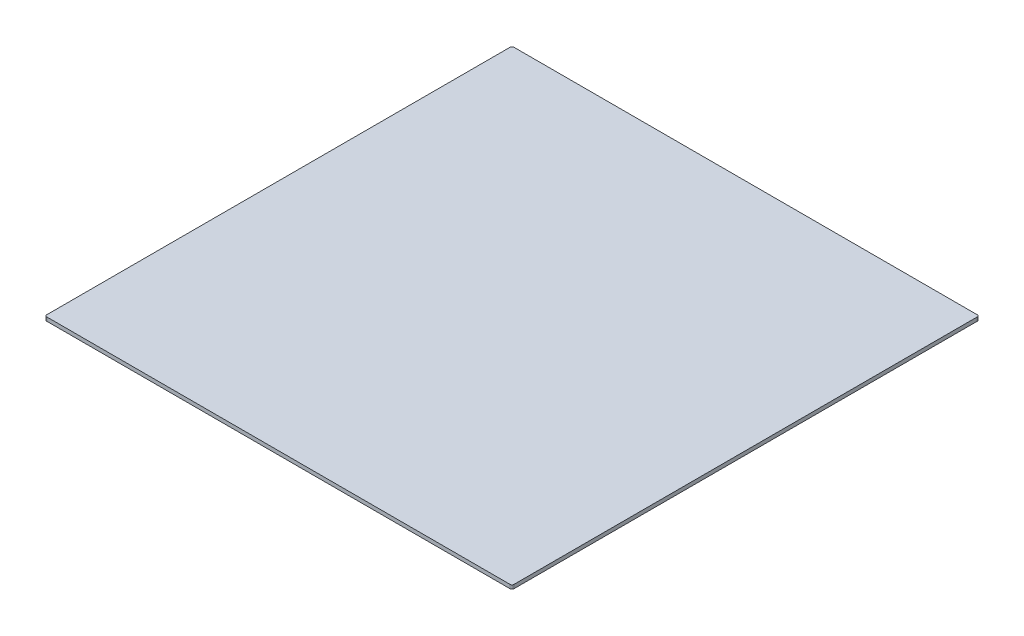
ISO-10303-21;
HEADER;
FILE_DESCRIPTION(('STEP AP214'),'2;1');
FILE_NAME('part.step','',(''),(''),'','','');
FILE_SCHEMA(('AUTOMOTIVE_DESIGN { 1 0 10303 214 1 1 1 1 }'));
ENDSEC;
DATA;
#1=APPLICATION_CONTEXT('core data for automotive mechanical design processes');
#2=APPLICATION_PROTOCOL_DEFINITION('international standard','automotive_design',2000,#1);
#3=PRODUCT_CONTEXT('',#1,'mechanical');
#4=PRODUCT('Part','Part','',(#3));
#5=PRODUCT_RELATED_PRODUCT_CATEGORY('part','',(#4));
#6=PRODUCT_DEFINITION_FORMATION('','',#4);
#7=PRODUCT_DEFINITION_CONTEXT('part definition',#1,'design');
#8=PRODUCT_DEFINITION('design','',#6,#7);
#9=PRODUCT_DEFINITION_SHAPE('','',#8);
#10=(LENGTH_UNIT() NAMED_UNIT(*) SI_UNIT(.MILLI.,.METRE.));
#11=(NAMED_UNIT(*) PLANE_ANGLE_UNIT() SI_UNIT($,.RADIAN.));
#12=(NAMED_UNIT(*) SI_UNIT($,.STERADIAN.) SOLID_ANGLE_UNIT());
#13=UNCERTAINTY_MEASURE_WITH_UNIT(LENGTH_MEASURE(1.E-05),#10,'distance_accuracy_value','');
#14=(GEOMETRIC_REPRESENTATION_CONTEXT(3) GLOBAL_UNCERTAINTY_ASSIGNED_CONTEXT((#13)) GLOBAL_UNIT_ASSIGNED_CONTEXT((#10,
#11,#12)) REPRESENTATION_CONTEXT('',''));
#15=CARTESIAN_POINT('',(0.,0.,0.));
#16=DIRECTION('',(0.,0.,1.));
#17=DIRECTION('',(1.,0.,0.));
#18=AXIS2_PLACEMENT_3D('',#15,#16,#17);
#19=CARTESIAN_POINT('',(123.5,1.,123.5));
#20=DIRECTION('',(-1.,0.,0.));
#21=DIRECTION('',(0.,0.,1.));
#22=AXIS2_PLACEMENT_3D('',#19,#20,#21);
#23=PLANE('',#22);
#24=DIRECTION('',(0.,0.,-1.));
#25=VECTOR('',#24,1.);
#26=CARTESIAN_POINT('',(123.5,-1.,123.5));
#27=LINE('',#26,#25);
#28=CARTESIAN_POINT('',(123.5,-1.,122.5));
#29=VERTEX_POINT('',#28);
#30=CARTESIAN_POINT('',(123.5,-1.,-122.5));
#31=VERTEX_POINT('',#30);
#32=EDGE_CURVE('E182',#29,#31,#27,.T.);
#33=ORIENTED_EDGE('',*,*,#32,.T.);
#34=DIRECTION('',(0.,-1.,0.));
#35=VECTOR('',#34,1.);
#36=CARTESIAN_POINT('',(123.5,1.,-122.5));
#37=LINE('',#36,#35);
#38=CARTESIAN_POINT('',(123.5,1.,-122.5));
#39=VERTEX_POINT('',#38);
#40=EDGE_CURVE('E11',#31,#39,#37,.F.);
#41=ORIENTED_EDGE('',*,*,#40,.T.);
#42=DIRECTION('',(0.,0.,-1.));
#43=VECTOR('',#42,1.);
#44=CARTESIAN_POINT('',(123.5,1.,123.5));
#45=LINE('',#44,#43);
#46=CARTESIAN_POINT('',(123.5,1.,122.5));
#47=VERTEX_POINT('',#46);
#48=EDGE_CURVE('E135',#47,#39,#45,.T.);
#49=ORIENTED_EDGE('',*,*,#48,.F.);
#50=DIRECTION('',(0.,-1.,0.));
#51=VECTOR('',#50,1.);
#52=CARTESIAN_POINT('',(123.5,1.,122.5));
#53=LINE('',#52,#51);
#54=EDGE_CURVE('E48',#47,#29,#53,.T.);
#55=ORIENTED_EDGE('',*,*,#54,.T.);
#56=EDGE_LOOP('',(#33,#41,#49,#55));
#57=FACE_BOUND('',#56,.T.);
#58=ADVANCED_FACE('F39',(#57),#23,.F.);
#59=CARTESIAN_POINT('',(-123.5,1.,-123.5));
#60=DIRECTION('',(0.,0.,1.));
#61=DIRECTION('',(1.,0.,0.));
#62=AXIS2_PLACEMENT_3D('',#59,#60,#61);
#63=PLANE('',#62);
#64=DIRECTION('',(-1.,0.,0.));
#65=VECTOR('',#64,1.);
#66=CARTESIAN_POINT('',(-123.5,-1.,-123.5));
#67=LINE('',#66,#65);
#68=CARTESIAN_POINT('',(122.5,-1.,-123.5));
#69=VERTEX_POINT('',#68);
#70=CARTESIAN_POINT('',(-122.5,-1.,-123.5));
#71=VERTEX_POINT('',#70);
#72=EDGE_CURVE('E142',#69,#71,#67,.T.);
#73=ORIENTED_EDGE('',*,*,#72,.T.);
#74=DIRECTION('',(0.,-1.,0.));
#75=VECTOR('',#74,1.);
#76=CARTESIAN_POINT('',(-122.5,1.,-123.5));
#77=LINE('',#76,#75);
#78=CARTESIAN_POINT('',(-122.5,1.,-123.5));
#79=VERTEX_POINT('',#78);
#80=EDGE_CURVE('E55',#71,#79,#77,.F.);
#81=ORIENTED_EDGE('',*,*,#80,.T.);
#82=DIRECTION('',(-1.,0.,0.));
#83=VECTOR('',#82,1.);
#84=CARTESIAN_POINT('',(-123.5,1.,-123.5));
#85=LINE('',#84,#83);
#86=CARTESIAN_POINT('',(122.5,1.,-123.5));
#87=VERTEX_POINT('',#86);
#88=EDGE_CURVE('E140',#87,#79,#85,.T.);
#89=ORIENTED_EDGE('',*,*,#88,.F.);
#90=DIRECTION('',(0.,-1.,0.));
#91=VECTOR('',#90,1.);
#92=CARTESIAN_POINT('',(122.5,1.,-123.5));
#93=LINE('',#92,#91);
#94=EDGE_CURVE('E171',#87,#69,#93,.T.);
#95=ORIENTED_EDGE('',*,*,#94,.T.);
#96=EDGE_LOOP('',(#73,#81,#89,#95));
#97=FACE_BOUND('',#96,.T.);
#98=ADVANCED_FACE('F207',(#97),#63,.F.);
#99=CARTESIAN_POINT('',(-123.5,1.,123.5));
#100=DIRECTION('',(1.,0.,0.));
#101=DIRECTION('',(0.,0.,-1.));
#102=AXIS2_PLACEMENT_3D('',#99,#100,#101);
#103=PLANE('',#102);
#104=DIRECTION('',(0.,0.,1.));
#105=VECTOR('',#104,1.);
#106=CARTESIAN_POINT('',(-123.5,-1.,123.5));
#107=LINE('',#106,#105);
#108=CARTESIAN_POINT('',(-123.5,-1.,-122.5));
#109=VERTEX_POINT('',#108);
#110=CARTESIAN_POINT('',(-123.5,-1.,122.5));
#111=VERTEX_POINT('',#110);
#112=EDGE_CURVE('E136',#109,#111,#107,.T.);
#113=ORIENTED_EDGE('',*,*,#112,.T.);
#114=DIRECTION('',(0.,-1.,0.));
#115=VECTOR('',#114,1.);
#116=CARTESIAN_POINT('',(-123.5,1.,122.5));
#117=LINE('',#116,#115);
#118=CARTESIAN_POINT('',(-123.5,1.,122.5));
#119=VERTEX_POINT('',#118);
#120=EDGE_CURVE('E111',#111,#119,#117,.F.);
#121=ORIENTED_EDGE('',*,*,#120,.T.);
#122=DIRECTION('',(0.,0.,1.));
#123=VECTOR('',#122,1.);
#124=CARTESIAN_POINT('',(-123.5,1.,123.5));
#125=LINE('',#124,#123);
#126=CARTESIAN_POINT('',(-123.5,1.,-122.5));
#127=VERTEX_POINT('',#126);
#128=EDGE_CURVE('E193',#127,#119,#125,.T.);
#129=ORIENTED_EDGE('',*,*,#128,.F.);
#130=DIRECTION('',(0.,-1.,0.));
#131=VECTOR('',#130,1.);
#132=CARTESIAN_POINT('',(-123.5,1.,-122.5));
#133=LINE('',#132,#131);
#134=EDGE_CURVE('E117',#127,#109,#133,.T.);
#135=ORIENTED_EDGE('',*,*,#134,.T.);
#136=EDGE_LOOP('',(#113,#121,#129,#135));
#137=FACE_BOUND('',#136,.T.);
#138=ADVANCED_FACE('F206',(#137),#103,.F.);
#139=CARTESIAN_POINT('',(-123.5,1.,123.5));
#140=DIRECTION('',(0.,0.,-1.));
#141=DIRECTION('',(-1.,0.,0.));
#142=AXIS2_PLACEMENT_3D('',#139,#140,#141);
#143=PLANE('',#142);
#144=DIRECTION('',(1.,0.,0.));
#145=VECTOR('',#144,1.);
#146=CARTESIAN_POINT('',(-123.5,1.,123.5));
#147=LINE('',#146,#145);
#148=CARTESIAN_POINT('',(-122.5,1.,123.5));
#149=VERTEX_POINT('',#148);
#150=CARTESIAN_POINT('',(122.5,1.,123.5));
#151=VERTEX_POINT('',#150);
#152=EDGE_CURVE('E127',#149,#151,#147,.T.);
#153=ORIENTED_EDGE('',*,*,#152,.F.);
#154=DIRECTION('',(0.,-1.,0.));
#155=VECTOR('',#154,1.);
#156=CARTESIAN_POINT('',(-122.5,1.,123.5));
#157=LINE('',#156,#155);
#158=CARTESIAN_POINT('',(-122.5,-1.,123.5));
#159=VERTEX_POINT('',#158);
#160=EDGE_CURVE('E110',#149,#159,#157,.T.);
#161=ORIENTED_EDGE('',*,*,#160,.T.);
#162=DIRECTION('',(1.,0.,0.));
#163=VECTOR('',#162,1.);
#164=CARTESIAN_POINT('',(-123.5,-1.,123.5));
#165=LINE('',#164,#163);
#166=CARTESIAN_POINT('',(122.5,-1.,123.5));
#167=VERTEX_POINT('',#166);
#168=EDGE_CURVE('E124',#159,#167,#165,.T.);
#169=ORIENTED_EDGE('',*,*,#168,.T.);
#170=DIRECTION('',(0.,-1.,0.));
#171=VECTOR('',#170,1.);
#172=CARTESIAN_POINT('',(122.5,1.,123.5));
#173=LINE('',#172,#171);
#174=EDGE_CURVE('E130',#167,#151,#173,.F.);
#175=ORIENTED_EDGE('',*,*,#174,.T.);
#176=EDGE_LOOP('',(#153,#161,#169,#175));
#177=FACE_BOUND('',#176,.T.);
#178=ADVANCED_FACE('F123',(#177),#143,.F.);
#179=CARTESIAN_POINT('',(0.,1.,0.));
#180=DIRECTION('',(0.,-1.,0.));
#181=DIRECTION('',(0.,0.,-1.));
#182=AXIS2_PLACEMENT_3D('',#179,#180,#181);
#183=PLANE('',#182);
#184=ORIENTED_EDGE('',*,*,#128,.T.);
#185=CARTESIAN_POINT('',(-122.5,1.,122.5));
#186=DIRECTION('',(0.,-1.,0.));
#187=DIRECTION('',(0.,0.,-1.));
#188=AXIS2_PLACEMENT_3D('',#185,#186,#187);
#189=CIRCLE('',#188,1.);
#190=EDGE_CURVE('E168',#119,#149,#189,.F.);
#191=ORIENTED_EDGE('',*,*,#190,.T.);
#192=ORIENTED_EDGE('',*,*,#152,.T.);
#193=CARTESIAN_POINT('',(122.5,1.,122.5));
#194=DIRECTION('',(0.,-1.,0.));
#195=DIRECTION('',(0.,0.,-1.));
#196=AXIS2_PLACEMENT_3D('',#193,#194,#195);
#197=CIRCLE('',#196,1.);
#198=EDGE_CURVE('E160',#151,#47,#197,.F.);
#199=ORIENTED_EDGE('',*,*,#198,.T.);
#200=ORIENTED_EDGE('',*,*,#48,.T.);
#201=CARTESIAN_POINT('',(122.5,1.,-122.5));
#202=DIRECTION('',(0.,-1.,0.));
#203=DIRECTION('',(0.,0.,-1.));
#204=AXIS2_PLACEMENT_3D('',#201,#202,#203);
#205=CIRCLE('',#204,1.);
#206=EDGE_CURVE('E62',#39,#87,#205,.F.);
#207=ORIENTED_EDGE('',*,*,#206,.T.);
#208=ORIENTED_EDGE('',*,*,#88,.T.);
#209=CARTESIAN_POINT('',(-122.5,1.,-122.5));
#210=DIRECTION('',(0.,-1.,0.));
#211=DIRECTION('',(0.,0.,-1.));
#212=AXIS2_PLACEMENT_3D('',#209,#210,#211);
#213=CIRCLE('',#212,1.);
#214=EDGE_CURVE('E165',#79,#127,#213,.F.);
#215=ORIENTED_EDGE('',*,*,#214,.T.);
#216=EDGE_LOOP('',(#184,#191,#192,#199,#200,#207,#208,#215));
#217=FACE_BOUND('',#216,.T.);
#218=ADVANCED_FACE('F199',(#217),#183,.F.);
#219=CARTESIAN_POINT('',(0.,-1.,0.));
#220=DIRECTION('',(0.,-1.,0.));
#221=DIRECTION('',(0.,0.,-1.));
#222=AXIS2_PLACEMENT_3D('',#219,#220,#221);
#223=PLANE('',#222);
#224=ORIENTED_EDGE('',*,*,#168,.F.);
#225=CARTESIAN_POINT('',(-122.5,-1.,122.5));
#226=DIRECTION('',(0.,-1.,0.));
#227=DIRECTION('',(0.,0.,-1.));
#228=AXIS2_PLACEMENT_3D('',#225,#226,#227);
#229=CIRCLE('',#228,1.);
#230=EDGE_CURVE('E106',#159,#111,#229,.T.);
#231=ORIENTED_EDGE('',*,*,#230,.T.);
#232=ORIENTED_EDGE('',*,*,#112,.F.);
#233=CARTESIAN_POINT('',(-122.5,-1.,-122.5));
#234=DIRECTION('',(0.,-1.,0.));
#235=DIRECTION('',(0.,0.,-1.));
#236=AXIS2_PLACEMENT_3D('',#233,#234,#235);
#237=CIRCLE('',#236,1.);
#238=EDGE_CURVE('E118',#109,#71,#237,.T.);
#239=ORIENTED_EDGE('',*,*,#238,.T.);
#240=ORIENTED_EDGE('',*,*,#72,.F.);
#241=CARTESIAN_POINT('',(122.5,-1.,-122.5));
#242=DIRECTION('',(0.,-1.,0.));
#243=DIRECTION('',(0.,0.,-1.));
#244=AXIS2_PLACEMENT_3D('',#241,#242,#243);
#245=CIRCLE('',#244,1.);
#246=EDGE_CURVE('E150',#69,#31,#245,.T.);
#247=ORIENTED_EDGE('',*,*,#246,.T.);
#248=ORIENTED_EDGE('',*,*,#32,.F.);
#249=CARTESIAN_POINT('',(122.5,-1.,122.5));
#250=DIRECTION('',(0.,-1.,0.));
#251=DIRECTION('',(0.,0.,-1.));
#252=AXIS2_PLACEMENT_3D('',#249,#250,#251);
#253=CIRCLE('',#252,1.);
#254=EDGE_CURVE('E129',#29,#167,#253,.T.);
#255=ORIENTED_EDGE('',*,*,#254,.T.);
#256=EDGE_LOOP('',(#224,#231,#232,#239,#240,#247,#248,#255));
#257=FACE_BOUND('',#256,.T.);
#258=ADVANCED_FACE('F132',(#257),#223,.T.);
#259=CARTESIAN_POINT('',(-122.5,1.,122.5));
#260=DIRECTION('',(0.,-1.,0.));
#261=DIRECTION('',(0.,0.,-1.));
#262=AXIS2_PLACEMENT_3D('',#259,#260,#261);
#263=CYLINDRICAL_SURFACE('',#262,1.);
#264=ORIENTED_EDGE('',*,*,#190,.F.);
#265=ORIENTED_EDGE('',*,*,#120,.F.);
#266=ORIENTED_EDGE('',*,*,#230,.F.);
#267=ORIENTED_EDGE('',*,*,#160,.F.);
#268=EDGE_LOOP('',(#264,#265,#266,#267));
#269=FACE_BOUND('',#268,.T.);
#270=ADVANCED_FACE('F109',(#269),#263,.T.);
#271=CARTESIAN_POINT('',(-122.5,1.,-122.5));
#272=DIRECTION('',(0.,-1.,0.));
#273=DIRECTION('',(0.,0.,-1.));
#274=AXIS2_PLACEMENT_3D('',#271,#272,#273);
#275=CYLINDRICAL_SURFACE('',#274,1.);
#276=ORIENTED_EDGE('',*,*,#214,.F.);
#277=ORIENTED_EDGE('',*,*,#80,.F.);
#278=ORIENTED_EDGE('',*,*,#238,.F.);
#279=ORIENTED_EDGE('',*,*,#134,.F.);
#280=EDGE_LOOP('',(#276,#277,#278,#279));
#281=FACE_BOUND('',#280,.T.);
#282=ADVANCED_FACE('F204',(#281),#275,.T.);
#283=CARTESIAN_POINT('',(122.5,1.,-122.5));
#284=DIRECTION('',(0.,-1.,0.));
#285=DIRECTION('',(0.,0.,-1.));
#286=AXIS2_PLACEMENT_3D('',#283,#284,#285);
#287=CYLINDRICAL_SURFACE('',#286,1.);
#288=ORIENTED_EDGE('',*,*,#206,.F.);
#289=ORIENTED_EDGE('',*,*,#40,.F.);
#290=ORIENTED_EDGE('',*,*,#246,.F.);
#291=ORIENTED_EDGE('',*,*,#94,.F.);
#292=EDGE_LOOP('',(#288,#289,#290,#291));
#293=FACE_BOUND('',#292,.T.);
#294=ADVANCED_FACE('F209',(#293),#287,.T.);
#295=CARTESIAN_POINT('',(122.5,1.,122.5));
#296=DIRECTION('',(0.,-1.,0.));
#297=DIRECTION('',(0.,0.,-1.));
#298=AXIS2_PLACEMENT_3D('',#295,#296,#297);
#299=CYLINDRICAL_SURFACE('',#298,1.);
#300=ORIENTED_EDGE('',*,*,#198,.F.);
#301=ORIENTED_EDGE('',*,*,#174,.F.);
#302=ORIENTED_EDGE('',*,*,#254,.F.);
#303=ORIENTED_EDGE('',*,*,#54,.F.);
#304=EDGE_LOOP('',(#300,#301,#302,#303));
#305=FACE_BOUND('',#304,.T.);
#306=ADVANCED_FACE('F41',(#305),#299,.T.);
#307=CLOSED_SHELL('',(#58,#98,#138,#178,#218,#258,#270,#282,#294,#306));
#308=MANIFOLD_SOLID_BREP('B2',#307);
#309=ADVANCED_BREP_SHAPE_REPRESENTATION('',(#18,#308),#14);
#310=SHAPE_DEFINITION_REPRESENTATION(#9,#309);
ENDSEC;
END-ISO-10303-21;
